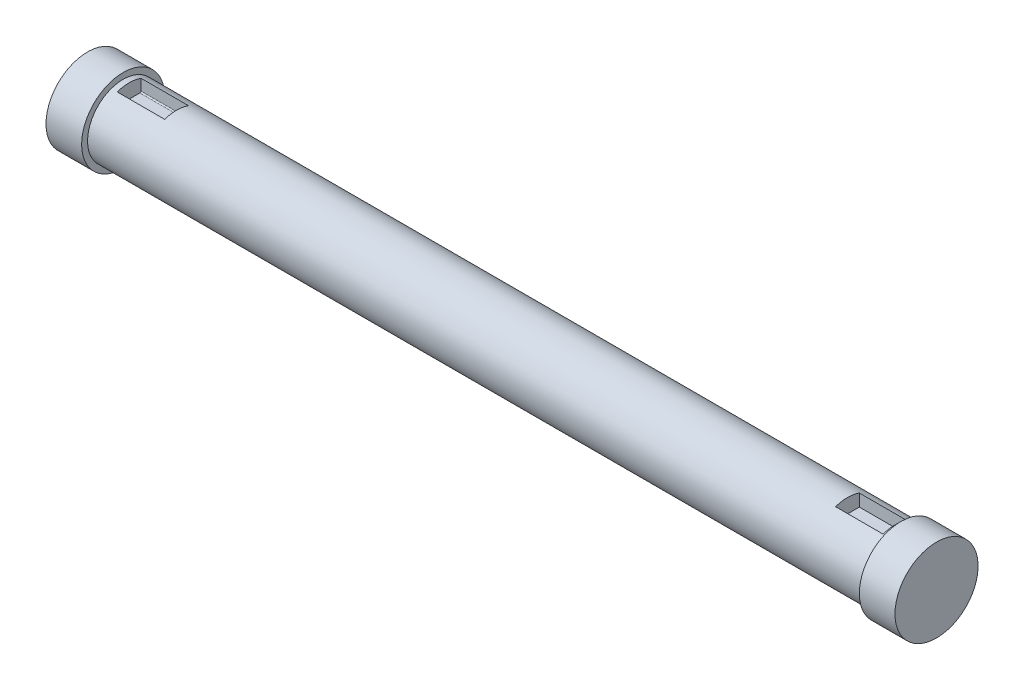
ISO-10303-21;
HEADER;
FILE_DESCRIPTION(('STEP AP214'),'2;1');
FILE_NAME('part.step','',(''),(''),'','','');
FILE_SCHEMA(('AUTOMOTIVE_DESIGN { 1 0 10303 214 1 1 1 1 }'));
ENDSEC;
DATA;
#1=APPLICATION_CONTEXT('core data for automotive mechanical design processes');
#2=APPLICATION_PROTOCOL_DEFINITION('international standard','automotive_design',2000,#1);
#3=PRODUCT_CONTEXT('',#1,'mechanical');
#4=PRODUCT('Part','Part','',(#3));
#5=PRODUCT_RELATED_PRODUCT_CATEGORY('part','',(#4));
#6=PRODUCT_DEFINITION_FORMATION('','',#4);
#7=PRODUCT_DEFINITION_CONTEXT('part definition',#1,'design');
#8=PRODUCT_DEFINITION('design','',#6,#7);
#9=PRODUCT_DEFINITION_SHAPE('','',#8);
#10=(LENGTH_UNIT() NAMED_UNIT(*) SI_UNIT(.MILLI.,.METRE.));
#11=(NAMED_UNIT(*) PLANE_ANGLE_UNIT() SI_UNIT($,.RADIAN.));
#12=(NAMED_UNIT(*) SI_UNIT($,.STERADIAN.) SOLID_ANGLE_UNIT());
#13=UNCERTAINTY_MEASURE_WITH_UNIT(LENGTH_MEASURE(1.E-05),#10,'distance_accuracy_value','');
#14=(GEOMETRIC_REPRESENTATION_CONTEXT(3) GLOBAL_UNCERTAINTY_ASSIGNED_CONTEXT((#13)) GLOBAL_UNIT_ASSIGNED_CONTEXT((#10,
#11,#12)) REPRESENTATION_CONTEXT('',''));
#15=CARTESIAN_POINT('',(0.,0.,0.));
#16=DIRECTION('',(0.,0.,1.));
#17=DIRECTION('',(1.,0.,0.));
#18=AXIS2_PLACEMENT_3D('',#15,#16,#17);
#19=CARTESIAN_POINT('',(57.5,0.,0.));
#20=DIRECTION('',(-1.,0.,0.));
#21=DIRECTION('',(0.,0.,1.));
#22=AXIS2_PLACEMENT_3D('',#19,#20,#21);
#23=CYLINDRICAL_SURFACE('',#22,3.);
#24=CARTESIAN_POINT('',(-11.,0.,0.));
#25=DIRECTION('',(-1.,0.,0.));
#26=DIRECTION('',(0.,0.,1.));
#27=AXIS2_PLACEMENT_3D('',#24,#25,#26);
#28=CIRCLE('',#27,3.);
#29=CARTESIAN_POINT('',(-11.,0.,3.));
#30=VERTEX_POINT('',#29);
#31=EDGE_CURVE('E176',#30,#30,#28,.F.);
#32=ORIENTED_EDGE('',*,*,#31,.T.);
#33=EDGE_LOOP('',(#32));
#34=FACE_BOUND('',#33,.T.);
#35=DIRECTION('',(-1.,0.,0.));
#36=VECTOR('',#35,1.);
#37=CARTESIAN_POINT('',(57.5,2.82842712474619,-1.));
#38=LINE('',#37,#36);
#39=CARTESIAN_POINT('',(-6.50000000000001,2.82842712474619,-1.));
#40=VERTEX_POINT('',#39);
#41=CARTESIAN_POINT('',(-10.5,2.82842712474619,-1.));
#42=VERTEX_POINT('',#41);
#43=EDGE_CURVE('E203',#40,#42,#38,.T.);
#44=ORIENTED_EDGE('',*,*,#43,.F.);
#45=CARTESIAN_POINT('',(-6.50000000000001,0.,0.));
#46=DIRECTION('',(-1.,0.,0.));
#47=DIRECTION('',(0.,0.,1.));
#48=AXIS2_PLACEMENT_3D('',#45,#46,#47);
#49=CIRCLE('',#48,3.);
#50=CARTESIAN_POINT('',(-6.50000000000001,2.82842712474619,1.));
#51=VERTEX_POINT('',#50);
#52=EDGE_CURVE('E211',#40,#51,#49,.F.);
#53=ORIENTED_EDGE('',*,*,#52,.T.);
#54=DIRECTION('',(-1.,0.,0.));
#55=VECTOR('',#54,1.);
#56=CARTESIAN_POINT('',(57.5,2.82842712474619,1.));
#57=LINE('',#56,#55);
#58=CARTESIAN_POINT('',(-10.5,2.82842712474619,1.));
#59=VERTEX_POINT('',#58);
#60=EDGE_CURVE('E207',#59,#51,#57,.F.);
#61=ORIENTED_EDGE('',*,*,#60,.F.);
#62=CARTESIAN_POINT('',(-10.5,0.,0.));
#63=DIRECTION('',(-1.,0.,0.));
#64=DIRECTION('',(0.,0.,1.));
#65=AXIS2_PLACEMENT_3D('',#62,#63,#64);
#66=CIRCLE('',#65,3.);
#67=EDGE_CURVE('E192',#42,#59,#66,.F.);
#68=ORIENTED_EDGE('',*,*,#67,.F.);
#69=EDGE_LOOP('',(#44,#53,#61,#68));
#70=FACE_BOUND('',#69,.T.);
#71=DIRECTION('',(-1.,0.,0.));
#72=VECTOR('',#71,1.);
#73=CARTESIAN_POINT('',(57.5,2.82842712474619,1.));
#74=LINE('',#73,#72);
#75=CARTESIAN_POINT('',(54.,2.82842712474619,1.));
#76=VERTEX_POINT('',#75);
#77=CARTESIAN_POINT('',(50.,2.82842712474619,1.));
#78=VERTEX_POINT('',#77);
#79=EDGE_CURVE('E62',#76,#78,#74,.T.);
#80=ORIENTED_EDGE('',*,*,#79,.T.);
#81=CARTESIAN_POINT('',(50.,0.,0.));
#82=DIRECTION('',(1.,0.,0.));
#83=DIRECTION('',(0.,0.,-1.));
#84=AXIS2_PLACEMENT_3D('',#81,#82,#83);
#85=CIRCLE('',#84,3.);
#86=CARTESIAN_POINT('',(50.,2.82842712474619,-1.));
#87=VERTEX_POINT('',#86);
#88=EDGE_CURVE('E12',#78,#87,#85,.F.);
#89=ORIENTED_EDGE('',*,*,#88,.T.);
#90=DIRECTION('',(-1.,0.,0.));
#91=VECTOR('',#90,1.);
#92=CARTESIAN_POINT('',(57.5,2.82842712474619,-1.));
#93=LINE('',#92,#91);
#94=CARTESIAN_POINT('',(54.,2.82842712474619,-1.));
#95=VERTEX_POINT('',#94);
#96=EDGE_CURVE('E242',#87,#95,#93,.F.);
#97=ORIENTED_EDGE('',*,*,#96,.T.);
#98=CARTESIAN_POINT('',(54.,0.,0.));
#99=DIRECTION('',(1.,0.,0.));
#100=DIRECTION('',(0.,0.,-1.));
#101=AXIS2_PLACEMENT_3D('',#98,#99,#100);
#102=CIRCLE('',#101,3.);
#103=EDGE_CURVE('E239',#76,#95,#102,.F.);
#104=ORIENTED_EDGE('',*,*,#103,.F.);
#105=EDGE_LOOP('',(#80,#89,#97,#104));
#106=FACE_BOUND('',#105,.T.);
#107=CARTESIAN_POINT('',(54.5,0.,0.));
#108=DIRECTION('',(1.,0.,0.));
#109=DIRECTION('',(0.,0.,-1.));
#110=AXIS2_PLACEMENT_3D('',#107,#108,#109);
#111=CIRCLE('',#110,3.);
#112=CARTESIAN_POINT('',(54.5,0.,-3.));
#113=VERTEX_POINT('',#112);
#114=EDGE_CURVE('E56',#113,#113,#111,.F.);
#115=ORIENTED_EDGE('',*,*,#114,.T.);
#116=EDGE_LOOP('',(#115));
#117=FACE_BOUND('',#116,.T.);
#118=ADVANCED_FACE('F52',(#34,#70,#106,#117),#23,.T.);
#119=CARTESIAN_POINT('',(-6.5,3.,1.));
#120=DIRECTION('',(0.,0.,1.));
#121=DIRECTION('',(0.,-1.,0.));
#122=AXIS2_PLACEMENT_3D('',#119,#120,#121);
#123=PLANE('',#122);
#124=DIRECTION('',(0.,1.,0.));
#125=VECTOR('',#124,1.);
#126=CARTESIAN_POINT('',(-6.5,3.,1.));
#127=LINE('',#126,#125);
#128=CARTESIAN_POINT('',(-6.5,1.9,1.));
#129=VERTEX_POINT('',#128);
#130=EDGE_CURVE('E182',#129,#51,#127,.T.);
#131=ORIENTED_EDGE('',*,*,#130,.F.);
#132=DIRECTION('',(-1.,0.,0.));
#133=VECTOR('',#132,1.);
#134=CARTESIAN_POINT('',(-10.5,1.9,1.));
#135=LINE('',#134,#133);
#136=CARTESIAN_POINT('',(-10.5,1.9,1.));
#137=VERTEX_POINT('',#136);
#138=EDGE_CURVE('E215',#129,#137,#135,.T.);
#139=ORIENTED_EDGE('',*,*,#138,.T.);
#140=DIRECTION('',(0.,1.,0.));
#141=VECTOR('',#140,1.);
#142=CARTESIAN_POINT('',(-10.5,3.,1.));
#143=LINE('',#142,#141);
#144=EDGE_CURVE('E180',#137,#59,#143,.T.);
#145=ORIENTED_EDGE('',*,*,#144,.T.);
#146=ORIENTED_EDGE('',*,*,#60,.T.);
#147=EDGE_LOOP('',(#131,#139,#145,#146));
#148=FACE_BOUND('',#147,.T.);
#149=ADVANCED_FACE('F289',(#148),#123,.F.);
#150=CARTESIAN_POINT('',(-6.5,1.8,-1.));
#151=DIRECTION('',(0.,-1.,0.));
#152=DIRECTION('',(0.,0.,-1.));
#153=AXIS2_PLACEMENT_3D('',#150,#151,#152);
#154=PLANE('',#153);
#155=DIRECTION('',(0.,0.,1.));
#156=VECTOR('',#155,1.);
#157=CARTESIAN_POINT('',(-10.5,1.8,-1.));
#158=LINE('',#157,#156);
#159=CARTESIAN_POINT('',(-10.5,1.8,-0.9));
#160=VERTEX_POINT('',#159);
#161=CARTESIAN_POINT('',(-10.5,1.8,0.9));
#162=VERTEX_POINT('',#161);
#163=EDGE_CURVE('E186',#160,#162,#158,.T.);
#164=ORIENTED_EDGE('',*,*,#163,.T.);
#165=DIRECTION('',(-1.,0.,0.));
#166=VECTOR('',#165,1.);
#167=CARTESIAN_POINT('',(-6.5,1.8,0.9));
#168=LINE('',#167,#166);
#169=CARTESIAN_POINT('',(-6.5,1.8,0.9));
#170=VERTEX_POINT('',#169);
#171=EDGE_CURVE('E78',#162,#170,#168,.F.);
#172=ORIENTED_EDGE('',*,*,#171,.T.);
#173=DIRECTION('',(0.,0.,1.));
#174=VECTOR('',#173,1.);
#175=CARTESIAN_POINT('',(-6.5,1.8,-1.));
#176=LINE('',#175,#174);
#177=CARTESIAN_POINT('',(-6.5,1.8,-0.9));
#178=VERTEX_POINT('',#177);
#179=EDGE_CURVE('E189',#178,#170,#176,.T.);
#180=ORIENTED_EDGE('',*,*,#179,.F.);
#181=DIRECTION('',(-1.,0.,0.));
#182=VECTOR('',#181,1.);
#183=CARTESIAN_POINT('',(-10.5,1.8,-0.9));
#184=LINE('',#183,#182);
#185=EDGE_CURVE('E225',#178,#160,#184,.T.);
#186=ORIENTED_EDGE('',*,*,#185,.T.);
#187=EDGE_LOOP('',(#164,#172,#180,#186));
#188=FACE_BOUND('',#187,.T.);
#189=ADVANCED_FACE('F295',(#188),#154,.F.);
#190=CARTESIAN_POINT('',(-6.5,3.,-1.));
#191=DIRECTION('',(0.,0.,-1.));
#192=DIRECTION('',(0.,1.,0.));
#193=AXIS2_PLACEMENT_3D('',#190,#191,#192);
#194=PLANE('',#193);
#195=DIRECTION('',(0.,-1.,0.));
#196=VECTOR('',#195,1.);
#197=CARTESIAN_POINT('',(-10.5,3.,-1.));
#198=LINE('',#197,#196);
#199=CARTESIAN_POINT('',(-10.5,1.9,-1.));
#200=VERTEX_POINT('',#199);
#201=EDGE_CURVE('E195',#42,#200,#198,.T.);
#202=ORIENTED_EDGE('',*,*,#201,.T.);
#203=DIRECTION('',(-1.,0.,0.));
#204=VECTOR('',#203,1.);
#205=CARTESIAN_POINT('',(-6.5,1.9,-1.));
#206=LINE('',#205,#204);
#207=CARTESIAN_POINT('',(-6.5,1.9,-1.));
#208=VERTEX_POINT('',#207);
#209=EDGE_CURVE('E70',#200,#208,#206,.F.);
#210=ORIENTED_EDGE('',*,*,#209,.T.);
#211=DIRECTION('',(0.,-1.,0.));
#212=VECTOR('',#211,1.);
#213=CARTESIAN_POINT('',(-6.5,3.,-1.));
#214=LINE('',#213,#212);
#215=EDGE_CURVE('E185',#40,#208,#214,.T.);
#216=ORIENTED_EDGE('',*,*,#215,.F.);
#217=ORIENTED_EDGE('',*,*,#43,.T.);
#218=EDGE_LOOP('',(#202,#210,#216,#217));
#219=FACE_BOUND('',#218,.T.);
#220=ADVANCED_FACE('F321',(#219),#194,.F.);
#221=CARTESIAN_POINT('',(-6.5,0.,0.));
#222=DIRECTION('',(-1.,0.,0.));
#223=DIRECTION('',(0.,0.,1.));
#224=AXIS2_PLACEMENT_3D('',#221,#222,#223);
#225=PLANE('',#224);
#226=ORIENTED_EDGE('',*,*,#179,.T.);
#227=CARTESIAN_POINT('',(-6.5,1.9,0.9));
#228=DIRECTION('',(-1.,0.,0.));
#229=DIRECTION('',(0.,0.,1.));
#230=AXIS2_PLACEMENT_3D('',#227,#228,#229);
#231=CIRCLE('',#230,0.1);
#232=EDGE_CURVE('E234',#170,#129,#231,.T.);
#233=ORIENTED_EDGE('',*,*,#232,.T.);
#234=ORIENTED_EDGE('',*,*,#130,.T.);
#235=ORIENTED_EDGE('',*,*,#52,.F.);
#236=ORIENTED_EDGE('',*,*,#215,.T.);
#237=CARTESIAN_POINT('',(-6.5,1.9,-0.9));
#238=DIRECTION('',(-1.,0.,0.));
#239=DIRECTION('',(0.,0.,1.));
#240=AXIS2_PLACEMENT_3D('',#237,#238,#239);
#241=CIRCLE('',#240,0.1);
#242=EDGE_CURVE('E231',#208,#178,#241,.T.);
#243=ORIENTED_EDGE('',*,*,#242,.T.);
#244=EDGE_LOOP('',(#226,#233,#234,#235,#236,#243));
#245=FACE_BOUND('',#244,.T.);
#246=ADVANCED_FACE('F309',(#245),#225,.T.);
#247=CARTESIAN_POINT('',(-10.5,0.,0.));
#248=DIRECTION('',(-1.,0.,0.));
#249=DIRECTION('',(0.,0.,1.));
#250=AXIS2_PLACEMENT_3D('',#247,#248,#249);
#251=PLANE('',#250);
#252=ORIENTED_EDGE('',*,*,#144,.F.);
#253=CARTESIAN_POINT('',(-10.5,1.9,0.9));
#254=DIRECTION('',(-1.,0.,0.));
#255=DIRECTION('',(0.,0.,1.));
#256=AXIS2_PLACEMENT_3D('',#253,#254,#255);
#257=CIRCLE('',#256,0.1);
#258=EDGE_CURVE('E222',#137,#162,#257,.F.);
#259=ORIENTED_EDGE('',*,*,#258,.T.);
#260=ORIENTED_EDGE('',*,*,#163,.F.);
#261=CARTESIAN_POINT('',(-10.5,1.9,-0.9));
#262=DIRECTION('',(-1.,0.,0.));
#263=DIRECTION('',(0.,0.,1.));
#264=AXIS2_PLACEMENT_3D('',#261,#262,#263);
#265=CIRCLE('',#264,0.1);
#266=EDGE_CURVE('E219',#160,#200,#265,.F.);
#267=ORIENTED_EDGE('',*,*,#266,.T.);
#268=ORIENTED_EDGE('',*,*,#201,.F.);
#269=ORIENTED_EDGE('',*,*,#67,.T.);
#270=EDGE_LOOP('',(#252,#259,#260,#267,#268,#269));
#271=FACE_BOUND('',#270,.T.);
#272=ADVANCED_FACE('F302',(#271),#251,.F.);
#273=CARTESIAN_POINT('',(-6.5,1.9,0.9));
#274=DIRECTION('',(1.,0.,0.));
#275=DIRECTION('',(0.,0.,-1.));
#276=AXIS2_PLACEMENT_3D('',#273,#274,#275);
#277=CYLINDRICAL_SURFACE('',#276,0.1);
#278=ORIENTED_EDGE('',*,*,#232,.F.);
#279=ORIENTED_EDGE('',*,*,#171,.F.);
#280=ORIENTED_EDGE('',*,*,#258,.F.);
#281=ORIENTED_EDGE('',*,*,#138,.F.);
#282=EDGE_LOOP('',(#278,#279,#280,#281));
#283=FACE_BOUND('',#282,.T.);
#284=ADVANCED_FACE('F300',(#283),#277,.F.);
#285=CARTESIAN_POINT('',(-6.5,1.9,-0.9));
#286=DIRECTION('',(1.,0.,0.));
#287=DIRECTION('',(0.,0.,-1.));
#288=AXIS2_PLACEMENT_3D('',#285,#286,#287);
#289=CYLINDRICAL_SURFACE('',#288,0.1);
#290=ORIENTED_EDGE('',*,*,#242,.F.);
#291=ORIENTED_EDGE('',*,*,#209,.F.);
#292=ORIENTED_EDGE('',*,*,#266,.F.);
#293=ORIENTED_EDGE('',*,*,#185,.F.);
#294=EDGE_LOOP('',(#290,#291,#292,#293));
#295=FACE_BOUND('',#294,.T.);
#296=ADVANCED_FACE('F54',(#295),#289,.F.);
#297=CARTESIAN_POINT('',(50.,3.,1.));
#298=DIRECTION('',(0.,0.,-1.));
#299=DIRECTION('',(0.,1.,0.));
#300=AXIS2_PLACEMENT_3D('',#297,#298,#299);
#301=PLANE('',#300);
#302=DIRECTION('',(0.,1.,0.));
#303=VECTOR('',#302,1.);
#304=CARTESIAN_POINT('',(54.,3.,1.));
#305=LINE('',#304,#303);
#306=CARTESIAN_POINT('',(54.,1.8,1.));
#307=VERTEX_POINT('',#306);
#308=EDGE_CURVE('E158',#307,#76,#305,.T.);
#309=ORIENTED_EDGE('',*,*,#308,.F.);
#310=DIRECTION('',(1.,0.,0.));
#311=VECTOR('',#310,1.);
#312=CARTESIAN_POINT('',(50.,1.8,1.));
#313=LINE('',#312,#311);
#314=CARTESIAN_POINT('',(50.,1.8,1.));
#315=VERTEX_POINT('',#314);
#316=EDGE_CURVE('E141',#315,#307,#313,.T.);
#317=ORIENTED_EDGE('',*,*,#316,.F.);
#318=DIRECTION('',(0.,1.,0.));
#319=VECTOR('',#318,1.);
#320=CARTESIAN_POINT('',(50.,3.,1.));
#321=LINE('',#320,#319);
#322=EDGE_CURVE('E150',#315,#78,#321,.T.);
#323=ORIENTED_EDGE('',*,*,#322,.T.);
#324=ORIENTED_EDGE('',*,*,#79,.F.);
#325=EDGE_LOOP('',(#309,#317,#323,#324));
#326=FACE_BOUND('',#325,.T.);
#327=ADVANCED_FACE('F154',(#326),#301,.T.);
#328=CARTESIAN_POINT('',(50.,3.,-1.));
#329=DIRECTION('',(0.,0.,1.));
#330=DIRECTION('',(0.,-1.,0.));
#331=AXIS2_PLACEMENT_3D('',#328,#329,#330);
#332=PLANE('',#331);
#333=DIRECTION('',(0.,-1.,0.));
#334=VECTOR('',#333,1.);
#335=CARTESIAN_POINT('',(50.,3.,-1.));
#336=LINE('',#335,#334);
#337=CARTESIAN_POINT('',(50.,1.8,-1.));
#338=VERTEX_POINT('',#337);
#339=EDGE_CURVE('E149',#87,#338,#336,.T.);
#340=ORIENTED_EDGE('',*,*,#339,.T.);
#341=DIRECTION('',(1.,0.,0.));
#342=VECTOR('',#341,1.);
#343=CARTESIAN_POINT('',(50.,1.8,-1.));
#344=LINE('',#343,#342);
#345=CARTESIAN_POINT('',(54.,1.8,-1.));
#346=VERTEX_POINT('',#345);
#347=EDGE_CURVE('E144',#338,#346,#344,.T.);
#348=ORIENTED_EDGE('',*,*,#347,.T.);
#349=DIRECTION('',(0.,-1.,0.));
#350=VECTOR('',#349,1.);
#351=CARTESIAN_POINT('',(54.,3.,-1.));
#352=LINE('',#351,#350);
#353=EDGE_CURVE('E163',#95,#346,#352,.T.);
#354=ORIENTED_EDGE('',*,*,#353,.F.);
#355=ORIENTED_EDGE('',*,*,#96,.F.);
#356=EDGE_LOOP('',(#340,#348,#354,#355));
#357=FACE_BOUND('',#356,.T.);
#358=ADVANCED_FACE('F353',(#357),#332,.T.);
#359=CARTESIAN_POINT('',(50.,1.8,-1.));
#360=DIRECTION('',(0.,1.,0.));
#361=DIRECTION('',(0.,0.,1.));
#362=AXIS2_PLACEMENT_3D('',#359,#360,#361);
#363=PLANE('',#362);
#364=DIRECTION('',(0.,0.,1.));
#365=VECTOR('',#364,1.);
#366=CARTESIAN_POINT('',(54.,1.8,-1.));
#367=LINE('',#366,#365);
#368=EDGE_CURVE('E166',#346,#307,#367,.T.);
#369=ORIENTED_EDGE('',*,*,#368,.F.);
#370=ORIENTED_EDGE('',*,*,#347,.F.);
#371=DIRECTION('',(0.,0.,1.));
#372=VECTOR('',#371,1.);
#373=CARTESIAN_POINT('',(50.,1.8,-1.));
#374=LINE('',#373,#372);
#375=EDGE_CURVE('E137',#338,#315,#374,.T.);
#376=ORIENTED_EDGE('',*,*,#375,.T.);
#377=ORIENTED_EDGE('',*,*,#316,.T.);
#378=EDGE_LOOP('',(#369,#370,#376,#377));
#379=FACE_BOUND('',#378,.T.);
#380=ADVANCED_FACE('F140',(#379),#363,.T.);
#381=CARTESIAN_POINT('',(50.,0.,0.));
#382=DIRECTION('',(1.,0.,0.));
#383=DIRECTION('',(0.,0.,1.));
#384=AXIS2_PLACEMENT_3D('',#381,#382,#383);
#385=PLANE('',#384);
#386=ORIENTED_EDGE('',*,*,#322,.F.);
#387=ORIENTED_EDGE('',*,*,#375,.F.);
#388=ORIENTED_EDGE('',*,*,#339,.F.);
#389=ORIENTED_EDGE('',*,*,#88,.F.);
#390=EDGE_LOOP('',(#386,#387,#388,#389));
#391=FACE_BOUND('',#390,.T.);
#392=ADVANCED_FACE('F161',(#391),#385,.T.);
#393=CARTESIAN_POINT('',(54.,0.,0.));
#394=DIRECTION('',(1.,0.,0.));
#395=DIRECTION('',(0.,0.,1.));
#396=AXIS2_PLACEMENT_3D('',#393,#394,#395);
#397=PLANE('',#396);
#398=ORIENTED_EDGE('',*,*,#308,.T.);
#399=ORIENTED_EDGE('',*,*,#103,.T.);
#400=ORIENTED_EDGE('',*,*,#353,.T.);
#401=ORIENTED_EDGE('',*,*,#368,.T.);
#402=EDGE_LOOP('',(#398,#399,#400,#401));
#403=FACE_BOUND('',#402,.T.);
#404=ADVANCED_FACE('F343',(#403),#397,.F.);
#405=CARTESIAN_POINT('',(-11.,0.,0.));
#406=DIRECTION('',(-1.,0.,0.));
#407=DIRECTION('',(0.,0.,1.));
#408=AXIS2_PLACEMENT_3D('',#405,#406,#407);
#409=CYLINDRICAL_SURFACE('',#408,3.5);
#410=CARTESIAN_POINT('',(-11.,0.,0.));
#411=DIRECTION('',(-1.,0.,0.));
#412=DIRECTION('',(0.,0.,1.));
#413=AXIS2_PLACEMENT_3D('',#410,#411,#412);
#414=CIRCLE('',#413,3.5);
#415=CARTESIAN_POINT('',(-11.,0.,3.5));
#416=VERTEX_POINT('',#415);
#417=EDGE_CURVE('E249',#416,#416,#414,.T.);
#418=ORIENTED_EDGE('',*,*,#417,.T.);
#419=EDGE_LOOP('',(#418));
#420=FACE_BOUND('',#419,.T.);
#421=CARTESIAN_POINT('',(-14.,0.,0.));
#422=DIRECTION('',(-1.,0.,0.));
#423=DIRECTION('',(0.,0.,1.));
#424=AXIS2_PLACEMENT_3D('',#421,#422,#423);
#425=CIRCLE('',#424,3.5);
#426=CARTESIAN_POINT('',(-14.,0.,3.5));
#427=VERTEX_POINT('',#426);
#428=EDGE_CURVE('E169',#427,#427,#425,.T.);
#429=ORIENTED_EDGE('',*,*,#428,.F.);
#430=EDGE_LOOP('',(#429));
#431=FACE_BOUND('',#430,.T.);
#432=ADVANCED_FACE('F337',(#420,#431),#409,.T.);
#433=CARTESIAN_POINT('',(-11.,0.,0.));
#434=DIRECTION('',(-1.,0.,0.));
#435=DIRECTION('',(0.,0.,1.));
#436=AXIS2_PLACEMENT_3D('',#433,#434,#435);
#437=PLANE('',#436);
#438=ORIENTED_EDGE('',*,*,#31,.F.);
#439=EDGE_LOOP('',(#438));
#440=FACE_BOUND('',#439,.T.);
#441=ORIENTED_EDGE('',*,*,#417,.F.);
#442=EDGE_LOOP('',(#441));
#443=FACE_BOUND('',#442,.T.);
#444=ADVANCED_FACE('F332',(#440,#443),#437,.F.);
#445=CARTESIAN_POINT('',(-14.,0.,0.));
#446=DIRECTION('',(-1.,0.,0.));
#447=DIRECTION('',(0.,0.,1.));
#448=AXIS2_PLACEMENT_3D('',#445,#446,#447);
#449=PLANE('',#448);
#450=ORIENTED_EDGE('',*,*,#428,.T.);
#451=EDGE_LOOP('',(#450));
#452=FACE_BOUND('',#451,.T.);
#453=ADVANCED_FACE('F285',(#452),#449,.T.);
#454=CARTESIAN_POINT('',(54.5,0.,0.));
#455=DIRECTION('',(1.,0.,0.));
#456=DIRECTION('',(0.,0.,-1.));
#457=AXIS2_PLACEMENT_3D('',#454,#455,#456);
#458=CYLINDRICAL_SURFACE('',#457,3.5);
#459=CARTESIAN_POINT('',(54.5,0.,0.));
#460=DIRECTION('',(-1.,0.,0.));
#461=DIRECTION('',(0.,0.,1.));
#462=AXIS2_PLACEMENT_3D('',#459,#460,#461);
#463=CIRCLE('',#462,3.5);
#464=CARTESIAN_POINT('',(54.5,0.,3.5));
#465=VERTEX_POINT('',#464);
#466=EDGE_CURVE('E263',#465,#465,#463,.T.);
#467=ORIENTED_EDGE('',*,*,#466,.F.);
#468=EDGE_LOOP('',(#467));
#469=FACE_BOUND('',#468,.T.);
#470=CARTESIAN_POINT('',(57.5,0.,0.));
#471=DIRECTION('',(-1.,0.,0.));
#472=DIRECTION('',(0.,0.,1.));
#473=AXIS2_PLACEMENT_3D('',#470,#471,#472);
#474=CIRCLE('',#473,3.5);
#475=CARTESIAN_POINT('',(57.5,0.,3.5));
#476=VERTEX_POINT('',#475);
#477=EDGE_CURVE('E259',#476,#476,#474,.T.);
#478=ORIENTED_EDGE('',*,*,#477,.T.);
#479=EDGE_LOOP('',(#478));
#480=FACE_BOUND('',#479,.T.);
#481=ADVANCED_FACE('F276',(#469,#480),#458,.T.);
#482=CARTESIAN_POINT('',(54.5,0.,0.));
#483=DIRECTION('',(1.,0.,0.));
#484=DIRECTION('',(0.,0.,1.));
#485=AXIS2_PLACEMENT_3D('',#482,#483,#484);
#486=PLANE('',#485);
#487=ORIENTED_EDGE('',*,*,#114,.F.);
#488=EDGE_LOOP('',(#487));
#489=FACE_BOUND('',#488,.T.);
#490=ORIENTED_EDGE('',*,*,#466,.T.);
#491=EDGE_LOOP('',(#490));
#492=FACE_BOUND('',#491,.T.);
#493=ADVANCED_FACE('F273',(#489,#492),#486,.F.);
#494=CARTESIAN_POINT('',(57.5,0.,0.));
#495=DIRECTION('',(1.,0.,0.));
#496=DIRECTION('',(0.,0.,-1.));
#497=AXIS2_PLACEMENT_3D('',#494,#495,#496);
#498=PLANE('',#497);
#499=ORIENTED_EDGE('',*,*,#477,.F.);
#500=EDGE_LOOP('',(#499));
#501=FACE_BOUND('',#500,.T.);
#502=ADVANCED_FACE('F275',(#501),#498,.T.);
#503=CLOSED_SHELL('',(#118,#149,#189,#220,#246,#272,#284,#296,#327,#358,#380,#392,#404,#432,
#444,#453,#481,#493,#502));
#504=MANIFOLD_SOLID_BREP('B2',#503);
#505=ADVANCED_BREP_SHAPE_REPRESENTATION('',(#18,#504),#14);
#506=SHAPE_DEFINITION_REPRESENTATION(#9,#505);
ENDSEC;
END-ISO-10303-21;
